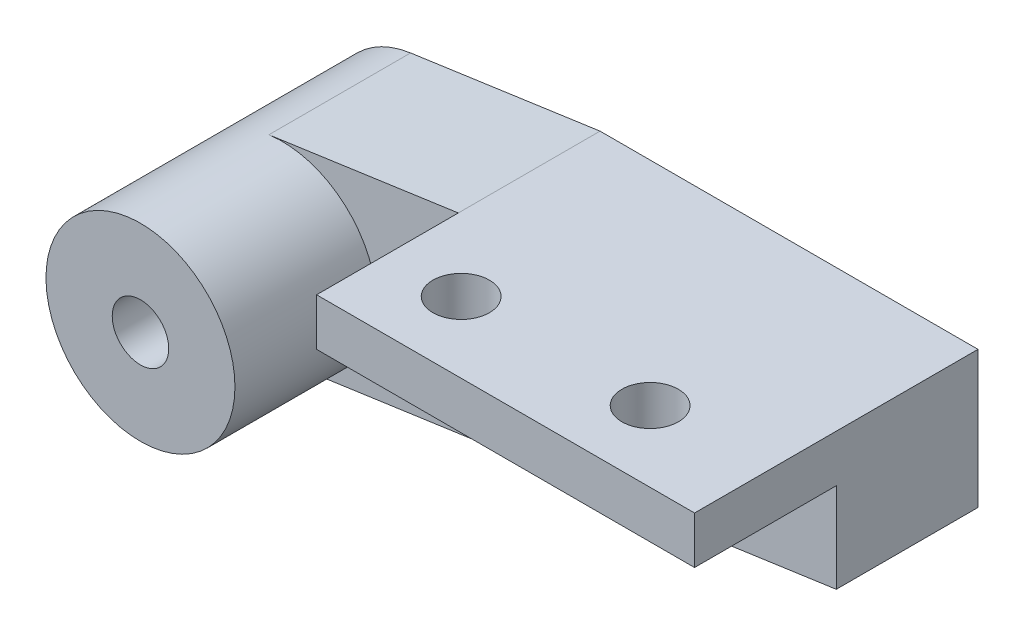
ISO-10303-21;
HEADER;
FILE_DESCRIPTION(('STEP AP214'),'2;1');
FILE_NAME('part.step','',(''),(''),'','','');
FILE_SCHEMA(('AUTOMOTIVE_DESIGN { 1 0 10303 214 1 1 1 1 }'));
ENDSEC;
DATA;
#1=APPLICATION_CONTEXT('core data for automotive mechanical design processes');
#2=APPLICATION_PROTOCOL_DEFINITION('international standard','automotive_design',2000,#1);
#3=PRODUCT_CONTEXT('',#1,'mechanical');
#4=PRODUCT('Part','Part','',(#3));
#5=PRODUCT_RELATED_PRODUCT_CATEGORY('part','',(#4));
#6=PRODUCT_DEFINITION_FORMATION('','',#4);
#7=PRODUCT_DEFINITION_CONTEXT('part definition',#1,'design');
#8=PRODUCT_DEFINITION('design','',#6,#7);
#9=PRODUCT_DEFINITION_SHAPE('','',#8);
#10=(LENGTH_UNIT() NAMED_UNIT(*) SI_UNIT(.MILLI.,.METRE.));
#11=(NAMED_UNIT(*) PLANE_ANGLE_UNIT() SI_UNIT($,.RADIAN.));
#12=(NAMED_UNIT(*) SI_UNIT($,.STERADIAN.) SOLID_ANGLE_UNIT());
#13=UNCERTAINTY_MEASURE_WITH_UNIT(LENGTH_MEASURE(1.E-05),#10,'distance_accuracy_value','');
#14=(GEOMETRIC_REPRESENTATION_CONTEXT(3) GLOBAL_UNCERTAINTY_ASSIGNED_CONTEXT((#13)) GLOBAL_UNIT_ASSIGNED_CONTEXT((#10,
#11,#12)) REPRESENTATION_CONTEXT('',''));
#15=CARTESIAN_POINT('',(0.,0.,0.));
#16=DIRECTION('',(0.,0.,1.));
#17=DIRECTION('',(1.,0.,0.));
#18=AXIS2_PLACEMENT_3D('',#15,#16,#17);
#19=CARTESIAN_POINT('',(37.2364,8.1026,9.525));
#20=DIRECTION('',(-1.,0.,0.));
#21=DIRECTION('',(0.,0.,1.));
#22=AXIS2_PLACEMENT_3D('',#19,#20,#21);
#23=PLANE('',#22);
#24=DIRECTION('',(0.,1.,0.));
#25=VECTOR('',#24,1.);
#26=CARTESIAN_POINT('',(37.2364,8.1026,0.));
#27=LINE('',#26,#25);
#28=CARTESIAN_POINT('',(37.2364,-1.10292479119246,0.));
#29=VERTEX_POINT('',#28);
#30=CARTESIAN_POINT('',(37.2364,8.1026,0.));
#31=VERTEX_POINT('',#30);
#32=EDGE_CURVE('E137',#29,#31,#27,.T.);
#33=ORIENTED_EDGE('',*,*,#32,.T.);
#34=DIRECTION('',(0.,0.,-1.));
#35=VECTOR('',#34,1.);
#36=CARTESIAN_POINT('',(37.2364,8.1026,9.525));
#37=LINE('',#36,#35);
#38=CARTESIAN_POINT('',(37.2364,8.1026,19.05));
#39=VERTEX_POINT('',#38);
#40=EDGE_CURVE('E42',#39,#31,#37,.T.);
#41=ORIENTED_EDGE('',*,*,#40,.F.);
#42=DIRECTION('',(0.,1.,0.));
#43=VECTOR('',#42,1.);
#44=CARTESIAN_POINT('',(37.2364,8.1026,19.05));
#45=LINE('',#44,#43);
#46=CARTESIAN_POINT('',(37.2364,4.9276,19.05));
#47=VERTEX_POINT('',#46);
#48=EDGE_CURVE('E159',#47,#39,#45,.T.);
#49=ORIENTED_EDGE('',*,*,#48,.F.);
#50=DIRECTION('',(0.,0.,-1.));
#51=VECTOR('',#50,1.);
#52=CARTESIAN_POINT('',(37.2364,4.9276,19.05));
#53=LINE('',#52,#51);
#54=CARTESIAN_POINT('',(37.2364,4.9276,9.525));
#55=VERTEX_POINT('',#54);
#56=EDGE_CURVE('E153',#47,#55,#53,.T.);
#57=ORIENTED_EDGE('',*,*,#56,.T.);
#58=DIRECTION('',(0.,1.,0.));
#59=VECTOR('',#58,1.);
#60=CARTESIAN_POINT('',(37.2364,8.1026,9.525));
#61=LINE('',#60,#59);
#62=CARTESIAN_POINT('',(37.2364,-1.10292479119246,9.525));
#63=VERTEX_POINT('',#62);
#64=EDGE_CURVE('E49',#63,#55,#61,.T.);
#65=ORIENTED_EDGE('',*,*,#64,.F.);
#66=DIRECTION('',(0.,0.,-1.));
#67=VECTOR('',#66,1.);
#68=CARTESIAN_POINT('',(37.2364,-1.10292479119246,9.525));
#69=LINE('',#68,#67);
#70=EDGE_CURVE('E122',#63,#29,#69,.T.);
#71=ORIENTED_EDGE('',*,*,#70,.T.);
#72=EDGE_LOOP('',(#33,#41,#49,#57,#65,#71));
#73=FACE_BOUND('',#72,.T.);
#74=ADVANCED_FACE('F35',(#73),#23,.F.);
#75=CARTESIAN_POINT('',(11.8364,8.1026,9.525));
#76=DIRECTION('',(0.,-1.,0.));
#77=DIRECTION('',(0.,0.,-1.));
#78=AXIS2_PLACEMENT_3D('',#75,#76,#77);
#79=PLANE('',#78);
#80=CARTESIAN_POINT('',(16.7894,8.1026,14.2875));
#81=DIRECTION('',(0.,-1.,0.));
#82=DIRECTION('',(0.,0.,-1.));
#83=AXIS2_PLACEMENT_3D('',#80,#81,#82);
#84=CIRCLE('',#83,1.89865);
#85=CARTESIAN_POINT('',(16.7894,8.1026,12.38885));
#86=VERTEX_POINT('',#85);
#87=EDGE_CURVE('E181',#86,#86,#84,.T.);
#88=ORIENTED_EDGE('',*,*,#87,.T.);
#89=EDGE_LOOP('',(#88));
#90=FACE_BOUND('',#89,.T.);
#91=CARTESIAN_POINT('',(29.4894,8.1026,14.2875));
#92=DIRECTION('',(0.,-1.,0.));
#93=DIRECTION('',(0.,0.,-1.));
#94=AXIS2_PLACEMENT_3D('',#91,#92,#93);
#95=CIRCLE('',#94,1.89864999999999);
#96=CARTESIAN_POINT('',(29.4894,8.1026,12.38885));
#97=VERTEX_POINT('',#96);
#98=EDGE_CURVE('E175',#97,#97,#95,.T.);
#99=ORIENTED_EDGE('',*,*,#98,.T.);
#100=EDGE_LOOP('',(#99));
#101=FACE_BOUND('',#100,.T.);
#102=DIRECTION('',(-1.,0.,0.));
#103=VECTOR('',#102,1.);
#104=CARTESIAN_POINT('',(11.8364,8.1026,0.));
#105=LINE('',#104,#103);
#106=CARTESIAN_POINT('',(11.8364,8.1026,0.));
#107=VERTEX_POINT('',#106);
#108=EDGE_CURVE('E130',#31,#107,#105,.T.);
#109=ORIENTED_EDGE('',*,*,#108,.T.);
#110=DIRECTION('',(0.,0.,-1.));
#111=VECTOR('',#110,1.);
#112=CARTESIAN_POINT('',(11.8364,8.1026,9.525));
#113=LINE('',#112,#111);
#114=CARTESIAN_POINT('',(11.8364,8.1026,9.525));
#115=VERTEX_POINT('',#114);
#116=EDGE_CURVE('E119',#115,#107,#113,.T.);
#117=ORIENTED_EDGE('',*,*,#116,.F.);
#118=DIRECTION('',(0.,0.,-1.));
#119=VECTOR('',#118,1.);
#120=CARTESIAN_POINT('',(11.8364,8.1026,19.05));
#121=LINE('',#120,#119);
#122=CARTESIAN_POINT('',(11.8364,8.1026,19.05));
#123=VERTEX_POINT('',#122);
#124=EDGE_CURVE('E139',#123,#115,#121,.T.);
#125=ORIENTED_EDGE('',*,*,#124,.F.);
#126=DIRECTION('',(-1.,0.,0.));
#127=VECTOR('',#126,1.);
#128=CARTESIAN_POINT('',(37.2364,8.1026,19.05));
#129=LINE('',#128,#127);
#130=EDGE_CURVE('E132',#39,#123,#129,.T.);
#131=ORIENTED_EDGE('',*,*,#130,.F.);
#132=ORIENTED_EDGE('',*,*,#40,.T.);
#133=EDGE_LOOP('',(#109,#117,#125,#131,#132));
#134=FACE_BOUND('',#133,.T.);
#135=ADVANCED_FACE('F129',(#90,#101,#134),#79,.F.);
#136=CARTESIAN_POINT('',(11.8364,8.1026,9.525));
#137=DIRECTION('',(0.141209321487239,-0.989979761169446,0.));
#138=DIRECTION('',(0.989979761169446,0.141209321487239,0.));
#139=AXIS2_PLACEMENT_3D('',#136,#137,#138);
#140=PLANE('',#139);
#141=DIRECTION('',(-0.989979761169446,-0.141209321487239,0.));
#142=VECTOR('',#141,1.);
#143=CARTESIAN_POINT('',(11.8364,8.1026,0.));
#144=LINE('',#143,#142);
#145=CARTESIAN_POINT('',(-0.896679191443967,6.28637148342598,0.));
#146=VERTEX_POINT('',#145);
#147=EDGE_CURVE('E118',#107,#146,#144,.T.);
#148=ORIENTED_EDGE('',*,*,#147,.T.);
#149=DIRECTION('',(0.,0.,-1.));
#150=VECTOR('',#149,1.);
#151=CARTESIAN_POINT('',(-0.896679191443967,6.28637148342598,9.525));
#152=LINE('',#151,#150);
#153=CARTESIAN_POINT('',(-0.896679191443967,6.28637148342598,9.525));
#154=VERTEX_POINT('',#153);
#155=EDGE_CURVE('E106',#154,#146,#152,.T.);
#156=ORIENTED_EDGE('',*,*,#155,.F.);
#157=DIRECTION('',(-0.989979761169446,-0.141209321487239,0.));
#158=VECTOR('',#157,1.);
#159=CARTESIAN_POINT('',(11.8364,8.1026,9.525));
#160=LINE('',#159,#158);
#161=EDGE_CURVE('E110',#115,#154,#160,.T.);
#162=ORIENTED_EDGE('',*,*,#161,.F.);
#163=ORIENTED_EDGE('',*,*,#116,.T.);
#164=EDGE_LOOP('',(#148,#156,#162,#163));
#165=FACE_BOUND('',#164,.T.);
#166=ADVANCED_FACE('F116',(#165),#140,.F.);
#167=CARTESIAN_POINT('',(0.,0.,9.525));
#168=DIRECTION('',(0.,0.,-1.));
#169=DIRECTION('',(-1.,0.,0.));
#170=AXIS2_PLACEMENT_3D('',#167,#168,#169);
#171=CYLINDRICAL_SURFACE('',#170,6.35);
#172=CARTESIAN_POINT('',(0.,0.,0.));
#173=DIRECTION('',(0.,0.,1.));
#174=DIRECTION('',(1.,0.,0.));
#175=AXIS2_PLACEMENT_3D('',#172,#173,#174);
#176=CIRCLE('',#175,6.35);
#177=CARTESIAN_POINT('',(0.896679191443963,-6.28637148342598,0.));
#178=VERTEX_POINT('',#177);
#179=EDGE_CURVE('E147',#146,#178,#176,.T.);
#180=ORIENTED_EDGE('',*,*,#179,.T.);
#181=DIRECTION('',(0.,0.,-1.));
#182=VECTOR('',#181,1.);
#183=CARTESIAN_POINT('',(0.896679191443963,-6.28637148342598,9.525));
#184=LINE('',#183,#182);
#185=CARTESIAN_POINT('',(0.896679191443963,-6.28637148342598,9.525));
#186=VERTEX_POINT('',#185);
#187=EDGE_CURVE('E108',#186,#178,#184,.T.);
#188=ORIENTED_EDGE('',*,*,#187,.F.);
#189=CARTESIAN_POINT('',(0.,0.,9.525));
#190=DIRECTION('',(0.,0.,1.));
#191=DIRECTION('',(1.,0.,0.));
#192=AXIS2_PLACEMENT_3D('',#189,#190,#191);
#193=CIRCLE('',#192,6.35);
#194=EDGE_CURVE('E11',#154,#186,#193,.F.);
#195=ORIENTED_EDGE('',*,*,#194,.F.);
#196=ORIENTED_EDGE('',*,*,#155,.T.);
#197=EDGE_LOOP('',(#180,#188,#195,#196));
#198=FACE_BOUND('',#197,.T.);
#199=CARTESIAN_POINT('',(0.,0.,19.05));
#200=DIRECTION('',(0.,0.,1.));
#201=DIRECTION('',(1.,0.,0.));
#202=AXIS2_PLACEMENT_3D('',#199,#200,#201);
#203=CIRCLE('',#202,6.35);
#204=CARTESIAN_POINT('',(6.35,0.,19.05));
#205=VERTEX_POINT('',#204);
#206=EDGE_CURVE('E161',#205,#205,#203,.T.);
#207=ORIENTED_EDGE('',*,*,#206,.F.);
#208=EDGE_LOOP('',(#207));
#209=FACE_BOUND('',#208,.T.);
#210=ADVANCED_FACE('F103',(#198,#209),#171,.T.);
#211=CARTESIAN_POINT('',(0.896679191443968,-6.28637148342598,9.525));
#212=DIRECTION('',(-0.141209321487239,0.989979761169446,0.));
#213=DIRECTION('',(-0.989979761169446,-0.141209321487239,0.));
#214=AXIS2_PLACEMENT_3D('',#211,#212,#213);
#215=PLANE('',#214);
#216=DIRECTION('',(0.989979761169446,0.141209321487239,0.));
#217=VECTOR('',#216,1.);
#218=CARTESIAN_POINT('',(0.896679191443968,-6.28637148342598,0.));
#219=LINE('',#218,#217);
#220=EDGE_CURVE('E77',#178,#29,#219,.T.);
#221=ORIENTED_EDGE('',*,*,#220,.T.);
#222=ORIENTED_EDGE('',*,*,#70,.F.);
#223=DIRECTION('',(0.989979761169446,0.141209321487239,0.));
#224=VECTOR('',#223,1.);
#225=CARTESIAN_POINT('',(0.896679191443968,-6.28637148342598,9.525));
#226=LINE('',#225,#224);
#227=EDGE_CURVE('E54',#186,#63,#226,.T.);
#228=ORIENTED_EDGE('',*,*,#227,.F.);
#229=ORIENTED_EDGE('',*,*,#187,.T.);
#230=EDGE_LOOP('',(#221,#222,#228,#229));
#231=FACE_BOUND('',#230,.T.);
#232=ADVANCED_FACE('F205',(#231),#215,.F.);
#233=CARTESIAN_POINT('',(0.,0.,9.525));
#234=DIRECTION('',(0.,0.,1.));
#235=DIRECTION('',(1.,0.,0.));
#236=AXIS2_PLACEMENT_3D('',#233,#234,#235);
#237=PLANE('',#236);
#238=ORIENTED_EDGE('',*,*,#161,.T.);
#239=ORIENTED_EDGE('',*,*,#194,.T.);
#240=ORIENTED_EDGE('',*,*,#227,.T.);
#241=ORIENTED_EDGE('',*,*,#64,.T.);
#242=DIRECTION('',(1.,0.,0.));
#243=VECTOR('',#242,1.);
#244=CARTESIAN_POINT('',(37.2364,4.9276,9.525));
#245=LINE('',#244,#243);
#246=CARTESIAN_POINT('',(11.8364,4.9276,9.525));
#247=VERTEX_POINT('',#246);
#248=EDGE_CURVE('E157',#247,#55,#245,.T.);
#249=ORIENTED_EDGE('',*,*,#248,.F.);
#250=DIRECTION('',(0.,-1.,0.));
#251=VECTOR('',#250,1.);
#252=CARTESIAN_POINT('',(11.8364,8.1026,9.525));
#253=LINE('',#252,#251);
#254=EDGE_CURVE('E82',#115,#247,#253,.T.);
#255=ORIENTED_EDGE('',*,*,#254,.F.);
#256=EDGE_LOOP('',(#238,#239,#240,#241,#249,#255));
#257=FACE_BOUND('',#256,.T.);
#258=ADVANCED_FACE('F111',(#257),#237,.T.);
#259=CARTESIAN_POINT('',(0.,0.,0.));
#260=DIRECTION('',(0.,0.,1.));
#261=DIRECTION('',(1.,0.,0.));
#262=AXIS2_PLACEMENT_3D('',#259,#260,#261);
#263=PLANE('',#262);
#264=CARTESIAN_POINT('',(0.,0.,0.));
#265=DIRECTION('',(0.,0.,-1.));
#266=DIRECTION('',(-1.,0.,0.));
#267=AXIS2_PLACEMENT_3D('',#264,#265,#266);
#268=CIRCLE('',#267,1.89865);
#269=CARTESIAN_POINT('',(-1.89865,0.,0.));
#270=VERTEX_POINT('',#269);
#271=EDGE_CURVE('E172',#270,#270,#268,.T.);
#272=ORIENTED_EDGE('',*,*,#271,.F.);
#273=EDGE_LOOP('',(#272));
#274=FACE_BOUND('',#273,.T.);
#275=ORIENTED_EDGE('',*,*,#32,.F.);
#276=ORIENTED_EDGE('',*,*,#220,.F.);
#277=ORIENTED_EDGE('',*,*,#179,.F.);
#278=ORIENTED_EDGE('',*,*,#147,.F.);
#279=ORIENTED_EDGE('',*,*,#108,.F.);
#280=EDGE_LOOP('',(#275,#276,#277,#278,#279));
#281=FACE_BOUND('',#280,.T.);
#282=ADVANCED_FACE('F204',(#274,#281),#263,.F.);
#283=CARTESIAN_POINT('',(11.8364,8.1026,19.05));
#284=DIRECTION('',(1.,0.,0.));
#285=DIRECTION('',(0.,1.,0.));
#286=AXIS2_PLACEMENT_3D('',#283,#284,#285);
#287=PLANE('',#286);
#288=ORIENTED_EDGE('',*,*,#254,.T.);
#289=DIRECTION('',(0.,0.,-1.));
#290=VECTOR('',#289,1.);
#291=CARTESIAN_POINT('',(11.8364,4.9276,19.05));
#292=LINE('',#291,#290);
#293=CARTESIAN_POINT('',(11.8364,4.9276,19.05));
#294=VERTEX_POINT('',#293);
#295=EDGE_CURVE('E142',#294,#247,#292,.T.);
#296=ORIENTED_EDGE('',*,*,#295,.F.);
#297=DIRECTION('',(0.,-1.,0.));
#298=VECTOR('',#297,1.);
#299=CARTESIAN_POINT('',(11.8364,8.1026,19.05));
#300=LINE('',#299,#298);
#301=EDGE_CURVE('E163',#123,#294,#300,.T.);
#302=ORIENTED_EDGE('',*,*,#301,.F.);
#303=ORIENTED_EDGE('',*,*,#124,.T.);
#304=EDGE_LOOP('',(#288,#296,#302,#303));
#305=FACE_BOUND('',#304,.T.);
#306=ADVANCED_FACE('F194',(#305),#287,.F.);
#307=CARTESIAN_POINT('',(37.2364,4.9276,19.05));
#308=DIRECTION('',(0.,1.,0.));
#309=DIRECTION('',(-1.,0.,0.));
#310=AXIS2_PLACEMENT_3D('',#307,#308,#309);
#311=PLANE('',#310);
#312=CARTESIAN_POINT('',(16.7894,4.9276,14.2875));
#313=DIRECTION('',(0.,-1.,0.));
#314=DIRECTION('',(0.,0.,-1.));
#315=AXIS2_PLACEMENT_3D('',#312,#313,#314);
#316=CIRCLE('',#315,1.89864999999999);
#317=CARTESIAN_POINT('',(16.7894,4.9276,12.38885));
#318=VERTEX_POINT('',#317);
#319=EDGE_CURVE('E184',#318,#318,#316,.T.);
#320=ORIENTED_EDGE('',*,*,#319,.F.);
#321=EDGE_LOOP('',(#320));
#322=FACE_BOUND('',#321,.T.);
#323=CARTESIAN_POINT('',(29.4894,4.9276,14.2875));
#324=DIRECTION('',(0.,-1.,0.));
#325=DIRECTION('',(0.,0.,-1.));
#326=AXIS2_PLACEMENT_3D('',#323,#324,#325);
#327=CIRCLE('',#326,1.89864999999999);
#328=CARTESIAN_POINT('',(29.4894,4.9276,12.38885));
#329=VERTEX_POINT('',#328);
#330=EDGE_CURVE('E178',#329,#329,#327,.T.);
#331=ORIENTED_EDGE('',*,*,#330,.F.);
#332=EDGE_LOOP('',(#331));
#333=FACE_BOUND('',#332,.T.);
#334=ORIENTED_EDGE('',*,*,#248,.T.);
#335=ORIENTED_EDGE('',*,*,#56,.F.);
#336=DIRECTION('',(1.,0.,0.));
#337=VECTOR('',#336,1.);
#338=CARTESIAN_POINT('',(37.2364,4.9276,19.05));
#339=LINE('',#338,#337);
#340=EDGE_CURVE('E156',#294,#47,#339,.T.);
#341=ORIENTED_EDGE('',*,*,#340,.F.);
#342=ORIENTED_EDGE('',*,*,#295,.T.);
#343=EDGE_LOOP('',(#334,#335,#341,#342));
#344=FACE_BOUND('',#343,.T.);
#345=ADVANCED_FACE('F190',(#322,#333,#344),#311,.F.);
#346=CARTESIAN_POINT('',(0.,0.,19.05));
#347=DIRECTION('',(0.,0.,-1.));
#348=DIRECTION('',(-1.,0.,0.));
#349=AXIS2_PLACEMENT_3D('',#346,#347,#348);
#350=PLANE('',#349);
#351=ORIENTED_EDGE('',*,*,#48,.T.);
#352=ORIENTED_EDGE('',*,*,#130,.T.);
#353=ORIENTED_EDGE('',*,*,#301,.T.);
#354=ORIENTED_EDGE('',*,*,#340,.T.);
#355=EDGE_LOOP('',(#351,#352,#353,#354));
#356=FACE_BOUND('',#355,.T.);
#357=ADVANCED_FACE('F193',(#356),#350,.F.);
#358=CARTESIAN_POINT('',(0.,0.,19.05));
#359=DIRECTION('',(0.,0.,1.));
#360=DIRECTION('',(1.,0.,0.));
#361=AXIS2_PLACEMENT_3D('',#358,#359,#360);
#362=PLANE('',#361);
#363=CARTESIAN_POINT('',(0.,0.,19.05));
#364=DIRECTION('',(0.,0.,-1.));
#365=DIRECTION('',(-1.,0.,0.));
#366=AXIS2_PLACEMENT_3D('',#363,#364,#365);
#367=CIRCLE('',#366,1.89865);
#368=CARTESIAN_POINT('',(-1.89865,0.,19.05));
#369=VERTEX_POINT('',#368);
#370=EDGE_CURVE('E169',#369,#369,#367,.T.);
#371=ORIENTED_EDGE('',*,*,#370,.T.);
#372=EDGE_LOOP('',(#371));
#373=FACE_BOUND('',#372,.T.);
#374=ORIENTED_EDGE('',*,*,#206,.T.);
#375=EDGE_LOOP('',(#374));
#376=FACE_BOUND('',#375,.T.);
#377=ADVANCED_FACE('F239',(#373,#376),#362,.T.);
#378=CARTESIAN_POINT('',(0.,0.,0.));
#379=DIRECTION('',(0.,0.,-1.));
#380=DIRECTION('',(-1.,0.,0.));
#381=AXIS2_PLACEMENT_3D('',#378,#379,#380);
#382=CYLINDRICAL_SURFACE('',#381,1.89865);
#383=ORIENTED_EDGE('',*,*,#370,.F.);
#384=EDGE_LOOP('',(#383));
#385=FACE_BOUND('',#384,.T.);
#386=ORIENTED_EDGE('',*,*,#271,.T.);
#387=EDGE_LOOP('',(#386));
#388=FACE_BOUND('',#387,.T.);
#389=ADVANCED_FACE('F231',(#385,#388),#382,.F.);
#390=CARTESIAN_POINT('',(29.4894,4.9276,14.2875));
#391=DIRECTION('',(0.,-1.,0.));
#392=DIRECTION('',(0.,0.,-1.));
#393=AXIS2_PLACEMENT_3D('',#390,#391,#392);
#394=CYLINDRICAL_SURFACE('',#393,1.89864999999999);
#395=ORIENTED_EDGE('',*,*,#98,.F.);
#396=EDGE_LOOP('',(#395));
#397=FACE_BOUND('',#396,.T.);
#398=ORIENTED_EDGE('',*,*,#330,.T.);
#399=EDGE_LOOP('',(#398));
#400=FACE_BOUND('',#399,.T.);
#401=ADVANCED_FACE('F228',(#397,#400),#394,.F.);
#402=CARTESIAN_POINT('',(16.7894,4.9276,14.2875));
#403=DIRECTION('',(0.,-1.,0.));
#404=DIRECTION('',(0.,0.,-1.));
#405=AXIS2_PLACEMENT_3D('',#402,#403,#404);
#406=CYLINDRICAL_SURFACE('',#405,1.89864999999999);
#407=ORIENTED_EDGE('',*,*,#87,.F.);
#408=EDGE_LOOP('',(#407));
#409=FACE_BOUND('',#408,.T.);
#410=ORIENTED_EDGE('',*,*,#319,.T.);
#411=EDGE_LOOP('',(#410));
#412=FACE_BOUND('',#411,.T.);
#413=ADVANCED_FACE('F188',(#409,#412),#406,.F.);
#414=CLOSED_SHELL('',(#74,#135,#166,#210,#232,#258,#282,#306,#345,#357,#377,#389,#401,#413));
#415=MANIFOLD_SOLID_BREP('B2',#414);
#416=ADVANCED_BREP_SHAPE_REPRESENTATION('',(#18,#415),#14);
#417=SHAPE_DEFINITION_REPRESENTATION(#9,#416);
ENDSEC;
END-ISO-10303-21;
